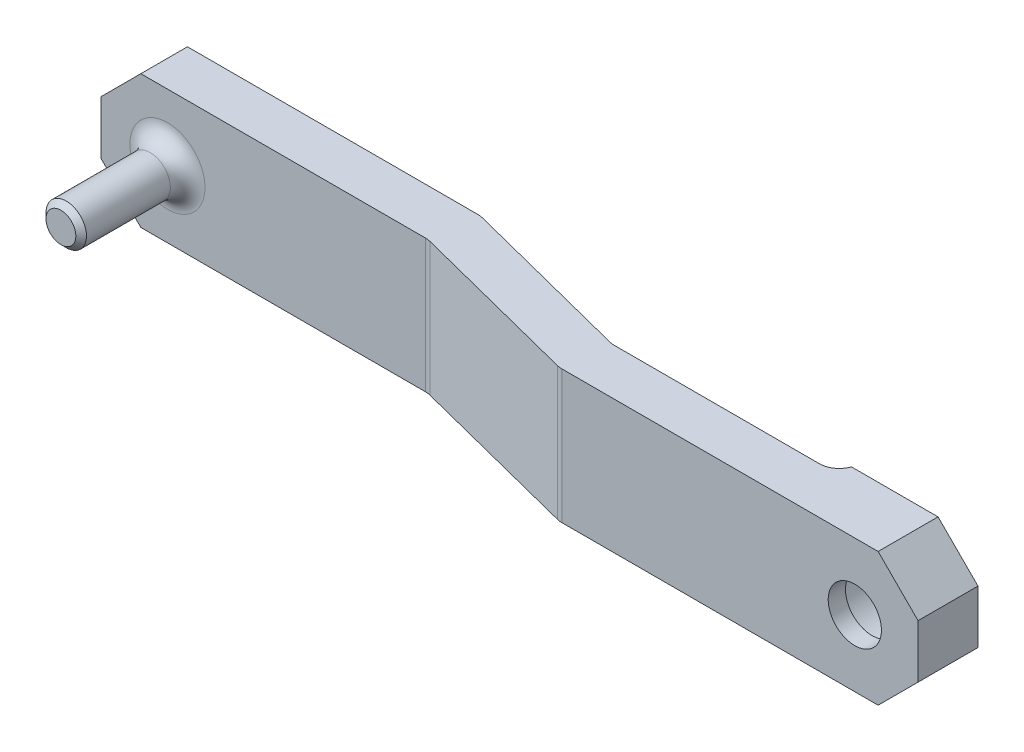
ISO-10303-21;
HEADER;
FILE_DESCRIPTION(('STEP AP214'),'2;1');
FILE_NAME('part.step','',(''),(''),'','','');
FILE_SCHEMA(('AUTOMOTIVE_DESIGN { 1 0 10303 214 1 1 1 1 }'));
ENDSEC;
DATA;
#1=APPLICATION_CONTEXT('core data for automotive mechanical design processes');
#2=APPLICATION_PROTOCOL_DEFINITION('international standard','automotive_design',2000,#1);
#3=PRODUCT_CONTEXT('',#1,'mechanical');
#4=PRODUCT('Part','Part','',(#3));
#5=PRODUCT_RELATED_PRODUCT_CATEGORY('part','',(#4));
#6=PRODUCT_DEFINITION_FORMATION('','',#4);
#7=PRODUCT_DEFINITION_CONTEXT('part definition',#1,'design');
#8=PRODUCT_DEFINITION('design','',#6,#7);
#9=PRODUCT_DEFINITION_SHAPE('','',#8);
#10=(LENGTH_UNIT() NAMED_UNIT(*) SI_UNIT(.MILLI.,.METRE.));
#11=(NAMED_UNIT(*) PLANE_ANGLE_UNIT() SI_UNIT($,.RADIAN.));
#12=(NAMED_UNIT(*) SI_UNIT($,.STERADIAN.) SOLID_ANGLE_UNIT());
#13=UNCERTAINTY_MEASURE_WITH_UNIT(LENGTH_MEASURE(1.E-05),#10,'distance_accuracy_value','');
#14=(GEOMETRIC_REPRESENTATION_CONTEXT(3) GLOBAL_UNCERTAINTY_ASSIGNED_CONTEXT((#13)) GLOBAL_UNIT_ASSIGNED_CONTEXT((#10,
#11,#12)) REPRESENTATION_CONTEXT('',''));
#15=CARTESIAN_POINT('',(0.,0.,0.));
#16=DIRECTION('',(0.,0.,1.));
#17=DIRECTION('',(1.,0.,0.));
#18=AXIS2_PLACEMENT_3D('',#15,#16,#17);
#19=CARTESIAN_POINT('',(31.75,12.7,0.));
#20=DIRECTION('',(0.,0.,1.));
#21=DIRECTION('',(1.,0.,0.));
#22=AXIS2_PLACEMENT_3D('',#19,#20,#21);
#23=PLANE('',#22);
#24=DIRECTION('',(-1.,0.,0.));
#25=VECTOR('',#24,1.);
#26=CARTESIAN_POINT('',(31.75,12.7,0.));
#27=LINE('',#26,#25);
#28=CARTESIAN_POINT('',(31.5103174828358,12.7,0.));
#29=VERTEX_POINT('',#28);
#30=CARTESIAN_POINT('',(3.80999999999999,12.7,0.));
#31=VERTEX_POINT('',#30);
#32=EDGE_CURVE('E552',#29,#31,#27,.T.);
#33=ORIENTED_EDGE('',*,*,#32,.F.);
#34=DIRECTION('',(0.,-1.,0.));
#35=VECTOR('',#34,1.);
#36=CARTESIAN_POINT('',(31.5103174828358,12.7,0.));
#37=LINE('',#36,#35);
#38=CARTESIAN_POINT('',(31.5103174828358,0.,0.));
#39=VERTEX_POINT('',#38);
#40=EDGE_CURVE('E689',#29,#39,#37,.T.);
#41=ORIENTED_EDGE('',*,*,#40,.T.);
#42=DIRECTION('',(-1.,0.,0.));
#43=VECTOR('',#42,1.);
#44=CARTESIAN_POINT('',(31.75,0.,0.));
#45=LINE('',#44,#43);
#46=CARTESIAN_POINT('',(3.81000000000001,0.,0.));
#47=VERTEX_POINT('',#46);
#48=EDGE_CURVE('E551',#39,#47,#45,.T.);
#49=ORIENTED_EDGE('',*,*,#48,.T.);
#50=DIRECTION('',(0.707106781186549,-0.707106781186546,0.));
#51=VECTOR('',#50,1.);
#52=CARTESIAN_POINT('',(0.,3.80999999999999,0.));
#53=LINE('',#52,#51);
#54=CARTESIAN_POINT('',(0.,3.80999999999999,0.));
#55=VERTEX_POINT('',#54);
#56=EDGE_CURVE('E662',#47,#55,#53,.F.);
#57=ORIENTED_EDGE('',*,*,#56,.T.);
#58=DIRECTION('',(0.,-1.,0.));
#59=VECTOR('',#58,1.);
#60=CARTESIAN_POINT('',(0.,12.7,0.));
#61=LINE('',#60,#59);
#62=CARTESIAN_POINT('',(0.,8.88999999999998,0.));
#63=VERTEX_POINT('',#62);
#64=EDGE_CURVE('E599',#63,#55,#61,.T.);
#65=ORIENTED_EDGE('',*,*,#64,.F.);
#66=DIRECTION('',(0.707106781186546,0.707106781186549,0.));
#67=VECTOR('',#66,1.);
#68=CARTESIAN_POINT('',(3.80999999999999,12.7,0.));
#69=LINE('',#68,#67);
#70=EDGE_CURVE('E658',#63,#31,#69,.T.);
#71=ORIENTED_EDGE('',*,*,#70,.T.);
#72=EDGE_LOOP('',(#33,#41,#49,#57,#65,#71));
#73=FACE_BOUND('',#72,.T.);
#74=ADVANCED_FACE('F51',(#73),#23,.F.);
#75=CARTESIAN_POINT('',(0.,12.7,0.));
#76=DIRECTION('',(1.,0.,0.));
#77=DIRECTION('',(0.,0.,-1.));
#78=AXIS2_PLACEMENT_3D('',#75,#76,#77);
#79=PLANE('',#78);
#80=ORIENTED_EDGE('',*,*,#64,.T.);
#81=DIRECTION('',(0.,0.,1.));
#82=VECTOR('',#81,1.);
#83=CARTESIAN_POINT('',(0.,3.80999999999999,0.));
#84=LINE('',#83,#82);
#85=CARTESIAN_POINT('',(0.,3.80999999999999,4.445));
#86=VERTEX_POINT('',#85);
#87=EDGE_CURVE('E648',#55,#86,#84,.T.);
#88=ORIENTED_EDGE('',*,*,#87,.T.);
#89=DIRECTION('',(0.,-1.,0.));
#90=VECTOR('',#89,1.);
#91=CARTESIAN_POINT('',(0.,12.7,4.445));
#92=LINE('',#91,#90);
#93=CARTESIAN_POINT('',(0.,8.88999999999998,4.445));
#94=VERTEX_POINT('',#93);
#95=EDGE_CURVE('E595',#94,#86,#92,.T.);
#96=ORIENTED_EDGE('',*,*,#95,.F.);
#97=DIRECTION('',(0.,0.,-1.));
#98=VECTOR('',#97,1.);
#99=CARTESIAN_POINT('',(0.,8.88999999999998,0.));
#100=LINE('',#99,#98);
#101=EDGE_CURVE('E645',#94,#63,#100,.T.);
#102=ORIENTED_EDGE('',*,*,#101,.T.);
#103=EDGE_LOOP('',(#80,#88,#96,#102));
#104=FACE_BOUND('',#103,.T.);
#105=ADVANCED_FACE('F252',(#104),#79,.F.);
#106=CARTESIAN_POINT('',(0.,12.7,4.445));
#107=DIRECTION('',(0.,0.,-1.));
#108=DIRECTION('',(-1.,0.,0.));
#109=AXIS2_PLACEMENT_3D('',#106,#107,#108);
#110=PLANE('',#109);
#111=CARTESIAN_POINT('',(6.35,6.35,4.445));
#112=DIRECTION('',(0.,0.,-1.));
#113=DIRECTION('',(-1.,0.,0.));
#114=AXIS2_PLACEMENT_3D('',#111,#112,#113);
#115=CIRCLE('',#114,3.5814);
#116=CARTESIAN_POINT('',(2.7686,6.35,4.445));
#117=VERTEX_POINT('',#116);
#118=EDGE_CURVE('E603',#117,#117,#115,.T.);
#119=ORIENTED_EDGE('',*,*,#118,.T.);
#120=EDGE_LOOP('',(#119));
#121=FACE_BOUND('',#120,.T.);
#122=DIRECTION('',(1.,0.,0.));
#123=VECTOR('',#122,1.);
#124=CARTESIAN_POINT('',(0.,0.,4.445));
#125=LINE('',#124,#123);
#126=CARTESIAN_POINT('',(3.81000000000002,0.,4.445));
#127=VERTEX_POINT('',#126);
#128=CARTESIAN_POINT('',(30.9510582761194,0.,4.445));
#129=VERTEX_POINT('',#128);
#130=EDGE_CURVE('E570',#127,#129,#125,.T.);
#131=ORIENTED_EDGE('',*,*,#130,.T.);
#132=DIRECTION('',(0.,-1.,0.));
#133=VECTOR('',#132,1.);
#134=CARTESIAN_POINT('',(30.9510582761194,12.7,4.445));
#135=LINE('',#134,#133);
#136=CARTESIAN_POINT('',(30.9510582761194,12.7,4.445));
#137=VERTEX_POINT('',#136);
#138=EDGE_CURVE('E68',#129,#137,#135,.F.);
#139=ORIENTED_EDGE('',*,*,#138,.T.);
#140=DIRECTION('',(1.,0.,0.));
#141=VECTOR('',#140,1.);
#142=CARTESIAN_POINT('',(0.,12.7,4.445));
#143=LINE('',#142,#141);
#144=CARTESIAN_POINT('',(3.80999999999999,12.7,4.445));
#145=VERTEX_POINT('',#144);
#146=EDGE_CURVE('E555',#145,#137,#143,.T.);
#147=ORIENTED_EDGE('',*,*,#146,.F.);
#148=DIRECTION('',(-0.707106781186546,-0.707106781186549,0.));
#149=VECTOR('',#148,1.);
#150=CARTESIAN_POINT('',(3.80999999999999,12.7,4.445));
#151=LINE('',#150,#149);
#152=EDGE_CURVE('E652',#145,#94,#151,.T.);
#153=ORIENTED_EDGE('',*,*,#152,.T.);
#154=ORIENTED_EDGE('',*,*,#95,.T.);
#155=DIRECTION('',(-0.707106781186549,0.707106781186546,0.));
#156=VECTOR('',#155,1.);
#157=CARTESIAN_POINT('',(0.,3.80999999999999,4.445));
#158=LINE('',#157,#156);
#159=EDGE_CURVE('E655',#86,#127,#158,.F.);
#160=ORIENTED_EDGE('',*,*,#159,.T.);
#161=EDGE_LOOP('',(#131,#139,#147,#153,#154,#160));
#162=FACE_BOUND('',#161,.T.);
#163=ADVANCED_FACE('F260',(#121,#162),#110,.F.);
#164=CARTESIAN_POINT('',(31.1907407932836,12.7,4.445));
#165=DIRECTION('',(0.247713861588513,0.,-0.968833237857221));
#166=DIRECTION('',(-0.968833237857221,0.,-0.247713861588513));
#167=AXIS2_PLACEMENT_3D('',#164,#165,#166);
#168=PLANE('',#167);
#169=DIRECTION('',(0.968833237857221,0.,0.247713861588513));
#170=VECTOR('',#169,1.);
#171=CARTESIAN_POINT('',(31.1907407932836,0.,4.445));
#172=LINE('',#171,#170);
#173=CARTESIAN_POINT('',(31.4229531824455,0.,4.504372681882));
#174=VERTEX_POINT('',#173);
#175=CARTESIAN_POINT('',(47.7860284041216,0.,8.68812731811801));
#176=VERTEX_POINT('',#175);
#177=EDGE_CURVE('E573',#174,#176,#172,.T.);
#178=ORIENTED_EDGE('',*,*,#177,.T.);
#179=DIRECTION('',(0.,-1.,0.));
#180=VECTOR('',#179,1.);
#181=CARTESIAN_POINT('',(47.7860284041216,12.7,8.68812731811801));
#182=LINE('',#181,#180);
#183=CARTESIAN_POINT('',(47.7860284041216,12.7,8.68812731811801));
#184=VERTEX_POINT('',#183);
#185=EDGE_CURVE('E679',#176,#184,#182,.F.);
#186=ORIENTED_EDGE('',*,*,#185,.T.);
#187=DIRECTION('',(0.968833237857221,0.,0.247713861588513));
#188=VECTOR('',#187,1.);
#189=CARTESIAN_POINT('',(31.1907407932836,12.7,4.445));
#190=LINE('',#189,#188);
#191=CARTESIAN_POINT('',(31.4229531824455,12.7,4.504372681882));
#192=VERTEX_POINT('',#191);
#193=EDGE_CURVE('E559',#192,#184,#190,.T.);
#194=ORIENTED_EDGE('',*,*,#193,.F.);
#195=DIRECTION('',(0.,-1.,0.));
#196=VECTOR('',#195,1.);
#197=CARTESIAN_POINT('',(31.4229531824455,0.,4.504372681882));
#198=LINE('',#197,#196);
#199=EDGE_CURVE('E675',#192,#174,#198,.T.);
#200=ORIENTED_EDGE('',*,*,#199,.T.);
#201=EDGE_LOOP('',(#178,#186,#194,#200));
#202=FACE_BOUND('',#201,.T.);
#203=ADVANCED_FACE('F473',(#202),#168,.F.);
#204=CARTESIAN_POINT('',(48.0182407932836,12.7,8.7475));
#205=DIRECTION('',(0.,0.,-1.));
#206=DIRECTION('',(-1.,0.,0.));
#207=AXIS2_PLACEMENT_3D('',#204,#205,#206);
#208=PLANE('',#207);
#209=CARTESIAN_POINT('',(76.2,6.35,8.7475));
#210=DIRECTION('',(0.,0.,-1.));
#211=DIRECTION('',(-1.,0.,0.));
#212=AXIS2_PLACEMENT_3D('',#209,#210,#211);
#213=CIRCLE('',#212,2.54);
#214=CARTESIAN_POINT('',(73.66,6.35,8.7475));
#215=VERTEX_POINT('',#214);
#216=EDGE_CURVE('E538',#215,#215,#213,.T.);
#217=ORIENTED_EDGE('',*,*,#216,.T.);
#218=EDGE_LOOP('',(#217));
#219=FACE_BOUND('',#218,.T.);
#220=DIRECTION('',(1.,0.,0.));
#221=VECTOR('',#220,1.);
#222=CARTESIAN_POINT('',(48.0182407932836,12.7,8.7475));
#223=LINE('',#222,#221);
#224=CARTESIAN_POINT('',(48.2579233104478,12.7,8.7475));
#225=VERTEX_POINT('',#224);
#226=CARTESIAN_POINT('',(78.4225,12.7,8.7475));
#227=VERTEX_POINT('',#226);
#228=EDGE_CURVE('E202',#225,#227,#223,.T.);
#229=ORIENTED_EDGE('',*,*,#228,.F.);
#230=DIRECTION('',(0.,-1.,0.));
#231=VECTOR('',#230,1.);
#232=CARTESIAN_POINT('',(48.2579233104478,12.7,8.7475));
#233=LINE('',#232,#231);
#234=CARTESIAN_POINT('',(48.2579233104478,0.,8.7475));
#235=VERTEX_POINT('',#234);
#236=EDGE_CURVE('E665',#225,#235,#233,.T.);
#237=ORIENTED_EDGE('',*,*,#236,.T.);
#238=DIRECTION('',(1.,0.,0.));
#239=VECTOR('',#238,1.);
#240=CARTESIAN_POINT('',(48.0182407932836,0.,8.7475));
#241=LINE('',#240,#239);
#242=CARTESIAN_POINT('',(78.4225,0.,8.7475));
#243=VERTEX_POINT('',#242);
#244=EDGE_CURVE('E577',#235,#243,#241,.T.);
#245=ORIENTED_EDGE('',*,*,#244,.T.);
#246=DIRECTION('',(-0.707106781186549,-0.707106781186546,0.));
#247=VECTOR('',#246,1.);
#248=CARTESIAN_POINT('',(82.2325,3.80999999999999,8.7475));
#249=LINE('',#248,#247);
#250=CARTESIAN_POINT('',(82.2325,3.80999999999999,8.7475));
#251=VERTEX_POINT('',#250);
#252=EDGE_CURVE('E636',#243,#251,#249,.F.);
#253=ORIENTED_EDGE('',*,*,#252,.T.);
#254=DIRECTION('',(0.,-1.,0.));
#255=VECTOR('',#254,1.);
#256=CARTESIAN_POINT('',(82.2325,12.7,8.7475));
#257=LINE('',#256,#255);
#258=CARTESIAN_POINT('',(82.2325,8.88999999999999,8.7475));
#259=VERTEX_POINT('',#258);
#260=EDGE_CURVE('E591',#259,#251,#257,.T.);
#261=ORIENTED_EDGE('',*,*,#260,.F.);
#262=DIRECTION('',(-0.707106781186546,0.707106781186549,0.));
#263=VECTOR('',#262,1.);
#264=CARTESIAN_POINT('',(78.4225,12.7,8.7475));
#265=LINE('',#264,#263);
#266=EDGE_CURVE('E632',#259,#227,#265,.T.);
#267=ORIENTED_EDGE('',*,*,#266,.T.);
#268=EDGE_LOOP('',(#229,#237,#245,#253,#261,#267));
#269=FACE_BOUND('',#268,.T.);
#270=ADVANCED_FACE('F468',(#219,#269),#208,.F.);
#271=CARTESIAN_POINT('',(82.2325,12.7,8.7475));
#272=DIRECTION('',(-1.,0.,0.));
#273=DIRECTION('',(0.,0.,1.));
#274=AXIS2_PLACEMENT_3D('',#271,#272,#273);
#275=PLANE('',#274);
#276=ORIENTED_EDGE('',*,*,#260,.T.);
#277=DIRECTION('',(0.,0.,-1.));
#278=VECTOR('',#277,1.);
#279=CARTESIAN_POINT('',(82.2325,3.80999999999999,8.7475));
#280=LINE('',#279,#278);
#281=CARTESIAN_POINT('',(82.2325,3.80999999999999,3.0325));
#282=VERTEX_POINT('',#281);
#283=EDGE_CURVE('E614',#251,#282,#280,.T.);
#284=ORIENTED_EDGE('',*,*,#283,.T.);
#285=DIRECTION('',(0.,-1.,0.));
#286=VECTOR('',#285,1.);
#287=CARTESIAN_POINT('',(82.2325,12.7,3.0325));
#288=LINE('',#287,#286);
#289=CARTESIAN_POINT('',(82.2325,8.88999999999999,3.0325));
#290=VERTEX_POINT('',#289);
#291=EDGE_CURVE('E213',#290,#282,#288,.T.);
#292=ORIENTED_EDGE('',*,*,#291,.F.);
#293=DIRECTION('',(0.,0.,1.));
#294=VECTOR('',#293,1.);
#295=CARTESIAN_POINT('',(82.2325,8.88999999999999,8.7475));
#296=LINE('',#295,#294);
#297=EDGE_CURVE('E611',#290,#259,#296,.T.);
#298=ORIENTED_EDGE('',*,*,#297,.T.);
#299=EDGE_LOOP('',(#276,#284,#292,#298));
#300=FACE_BOUND('',#299,.T.);
#301=ADVANCED_FACE('F332',(#300),#275,.F.);
#302=CARTESIAN_POINT('',(82.2325,12.7,3.0325));
#303=DIRECTION('',(0.,0.,1.));
#304=DIRECTION('',(1.,0.,0.));
#305=AXIS2_PLACEMENT_3D('',#302,#303,#304);
#306=PLANE('',#305);
#307=CARTESIAN_POINT('',(76.2,6.35,3.0325));
#308=DIRECTION('',(0.,0.,1.));
#309=DIRECTION('',(1.,0.,0.));
#310=AXIS2_PLACEMENT_3D('',#307,#308,#309);
#311=CIRCLE('',#310,4.74980000000003);
#312=CARTESIAN_POINT('',(80.9498,6.35,3.0325));
#313=VERTEX_POINT('',#312);
#314=EDGE_CURVE('E227',#313,#313,#311,.T.);
#315=ORIENTED_EDGE('',*,*,#314,.T.);
#316=EDGE_LOOP('',(#315));
#317=FACE_BOUND('',#316,.T.);
#318=ORIENTED_EDGE('',*,*,#291,.T.);
#319=DIRECTION('',(0.707106781186549,0.707106781186546,0.));
#320=VECTOR('',#319,1.);
#321=CARTESIAN_POINT('',(82.2325,3.80999999999999,3.0325));
#322=LINE('',#321,#320);
#323=CARTESIAN_POINT('',(78.4225,0.,3.0325));
#324=VERTEX_POINT('',#323);
#325=EDGE_CURVE('E621',#282,#324,#322,.F.);
#326=ORIENTED_EDGE('',*,*,#325,.T.);
#327=DIRECTION('',(-1.,0.,0.));
#328=VECTOR('',#327,1.);
#329=CARTESIAN_POINT('',(82.2325,0.,3.0325));
#330=LINE('',#329,#328);
#331=CARTESIAN_POINT('',(70.1675,0.,3.0325));
#332=VERTEX_POINT('',#331);
#333=EDGE_CURVE('E210',#324,#332,#330,.T.);
#334=ORIENTED_EDGE('',*,*,#333,.T.);
#335=DIRECTION('',(0.,-1.,0.));
#336=VECTOR('',#335,1.);
#337=CARTESIAN_POINT('',(70.1675,12.7,3.0325));
#338=LINE('',#337,#336);
#339=CARTESIAN_POINT('',(70.1675,12.7,3.0325));
#340=VERTEX_POINT('',#339);
#341=EDGE_CURVE('E206',#340,#332,#338,.T.);
#342=ORIENTED_EDGE('',*,*,#341,.F.);
#343=DIRECTION('',(-1.,0.,0.));
#344=VECTOR('',#343,1.);
#345=CARTESIAN_POINT('',(82.2325,12.7,3.0325));
#346=LINE('',#345,#344);
#347=CARTESIAN_POINT('',(78.4225,12.7,3.0325));
#348=VERTEX_POINT('',#347);
#349=EDGE_CURVE('E189',#348,#340,#346,.T.);
#350=ORIENTED_EDGE('',*,*,#349,.F.);
#351=DIRECTION('',(0.707106781186546,-0.707106781186549,0.));
#352=VECTOR('',#351,1.);
#353=CARTESIAN_POINT('',(78.4225,12.7,3.0325));
#354=LINE('',#353,#352);
#355=EDGE_CURVE('E618',#348,#290,#354,.T.);
#356=ORIENTED_EDGE('',*,*,#355,.T.);
#357=EDGE_LOOP('',(#318,#326,#334,#342,#350,#356));
#358=FACE_BOUND('',#357,.T.);
#359=ADVANCED_FACE('F208',(#317,#358),#306,.F.);
#360=CARTESIAN_POINT('',(70.1675,12.7,4.3025));
#361=DIRECTION('',(0.,0.,1.));
#362=DIRECTION('',(1.,0.,0.));
#363=AXIS2_PLACEMENT_3D('',#360,#361,#362);
#364=PLANE('',#363);
#365=DIRECTION('',(-1.,0.,0.));
#366=VECTOR('',#365,1.);
#367=CARTESIAN_POINT('',(70.1675,0.,4.3025));
#368=LINE('',#367,#366);
#369=CARTESIAN_POINT('',(68.3714487757862,0.,4.3025));
#370=VERTEX_POINT('',#369);
#371=CARTESIAN_POINT('',(48.8171825171642,0.,4.30250000000001));
#372=VERTEX_POINT('',#371);
#373=EDGE_CURVE('E582',#370,#372,#368,.T.);
#374=ORIENTED_EDGE('',*,*,#373,.T.);
#375=DIRECTION('',(0.,-1.,0.));
#376=VECTOR('',#375,1.);
#377=CARTESIAN_POINT('',(48.8171825171642,12.7,4.30250000000001));
#378=LINE('',#377,#376);
#379=CARTESIAN_POINT('',(48.8171825171642,12.7,4.30250000000001));
#380=VERTEX_POINT('',#379);
#381=EDGE_CURVE('E702',#372,#380,#378,.F.);
#382=ORIENTED_EDGE('',*,*,#381,.T.);
#383=DIRECTION('',(-1.,0.,0.));
#384=VECTOR('',#383,1.);
#385=CARTESIAN_POINT('',(70.1675,12.7,4.3025));
#386=LINE('',#385,#384);
#387=CARTESIAN_POINT('',(68.3714487757862,12.7,4.3025));
#388=VERTEX_POINT('',#387);
#389=EDGE_CURVE('E201',#388,#380,#386,.T.);
#390=ORIENTED_EDGE('',*,*,#389,.F.);
#391=DIRECTION('',(0.,-1.,0.));
#392=VECTOR('',#391,1.);
#393=CARTESIAN_POINT('',(68.3714487757862,12.7,4.3025));
#394=LINE('',#393,#392);
#395=EDGE_CURVE('E219',#388,#370,#394,.T.);
#396=ORIENTED_EDGE('',*,*,#395,.T.);
#397=EDGE_LOOP('',(#374,#382,#390,#396));
#398=FACE_BOUND('',#397,.T.);
#399=ADVANCED_FACE('F331',(#398),#364,.F.);
#400=CARTESIAN_POINT('',(48.5775,12.7,4.30250000000001));
#401=DIRECTION('',(-0.247713861588513,0.,0.968833237857221));
#402=DIRECTION('',(0.968833237857221,0.,0.247713861588513));
#403=AXIS2_PLACEMENT_3D('',#400,#401,#402);
#404=PLANE('',#403);
#405=DIRECTION('',(-0.968833237857221,0.,-0.247713861588513));
#406=VECTOR('',#405,1.);
#407=CARTESIAN_POINT('',(48.5775,0.,4.30250000000001));
#408=LINE('',#407,#406);
#409=CARTESIAN_POINT('',(48.3452876108381,0.,4.24312731811801));
#410=VERTEX_POINT('',#409);
#411=CARTESIAN_POINT('',(31.9822123891619,0.,0.059372681881993));
#412=VERTEX_POINT('',#411);
#413=EDGE_CURVE('E556',#410,#412,#408,.T.);
#414=ORIENTED_EDGE('',*,*,#413,.T.);
#415=DIRECTION('',(0.,-1.,0.));
#416=VECTOR('',#415,1.);
#417=CARTESIAN_POINT('',(31.9822123891619,12.7,0.0593726818819938));
#418=LINE('',#417,#416);
#419=CARTESIAN_POINT('',(31.9822123891619,12.7,0.059372681881993));
#420=VERTEX_POINT('',#419);
#421=EDGE_CURVE('E697',#412,#420,#418,.F.);
#422=ORIENTED_EDGE('',*,*,#421,.T.);
#423=DIRECTION('',(-0.968833237857221,0.,-0.247713861588513));
#424=VECTOR('',#423,1.);
#425=CARTESIAN_POINT('',(48.5775,12.7,4.30250000000001));
#426=LINE('',#425,#424);
#427=CARTESIAN_POINT('',(48.3452876108381,12.7,4.24312731811801));
#428=VERTEX_POINT('',#427);
#429=EDGE_CURVE('E214',#428,#420,#426,.T.);
#430=ORIENTED_EDGE('',*,*,#429,.F.);
#431=DIRECTION('',(0.,-1.,0.));
#432=VECTOR('',#431,1.);
#433=CARTESIAN_POINT('',(48.3452876108381,0.,4.24312731811801));
#434=LINE('',#433,#432);
#435=EDGE_CURVE('E693',#428,#410,#434,.T.);
#436=ORIENTED_EDGE('',*,*,#435,.T.);
#437=EDGE_LOOP('',(#414,#422,#430,#436));
#438=FACE_BOUND('',#437,.T.);
#439=ADVANCED_FACE('F448',(#438),#404,.F.);
#440=CARTESIAN_POINT('',(0.,12.7,0.));
#441=DIRECTION('',(0.,1.,0.));
#442=DIRECTION('',(0.,0.,1.));
#443=AXIS2_PLACEMENT_3D('',#440,#441,#442);
#444=PLANE('',#443);
#445=ORIENTED_EDGE('',*,*,#193,.T.);
#446=CARTESIAN_POINT('',(48.2579233104478,12.7,6.8425));
#447=DIRECTION('',(0.,1.,0.));
#448=DIRECTION('',(0.,0.,1.));
#449=AXIS2_PLACEMENT_3D('',#446,#447,#448);
#450=CIRCLE('',#449,1.905);
#451=EDGE_CURVE('E684',#184,#225,#450,.T.);
#452=ORIENTED_EDGE('',*,*,#451,.T.);
#453=ORIENTED_EDGE('',*,*,#228,.T.);
#454=DIRECTION('',(0.,0.,-1.));
#455=VECTOR('',#454,1.);
#456=CARTESIAN_POINT('',(78.4225,12.7,3.0325));
#457=LINE('',#456,#455);
#458=EDGE_CURVE('E198',#227,#348,#457,.T.);
#459=ORIENTED_EDGE('',*,*,#458,.T.);
#460=ORIENTED_EDGE('',*,*,#349,.T.);
#461=CARTESIAN_POINT('',(68.3714487757862,12.7,2.3975));
#462=DIRECTION('',(0.,1.,0.));
#463=DIRECTION('',(0.,0.,1.));
#464=AXIS2_PLACEMENT_3D('',#461,#462,#463);
#465=CIRCLE('',#464,1.905);
#466=EDGE_CURVE('E195',#340,#388,#465,.F.);
#467=ORIENTED_EDGE('',*,*,#466,.T.);
#468=ORIENTED_EDGE('',*,*,#389,.T.);
#469=CARTESIAN_POINT('',(48.8171825171642,12.7,2.39750000000001));
#470=DIRECTION('',(0.,1.,0.));
#471=DIRECTION('',(0.,0.,1.));
#472=AXIS2_PLACEMENT_3D('',#469,#470,#471);
#473=CIRCLE('',#472,1.905);
#474=EDGE_CURVE('E229',#380,#428,#473,.F.);
#475=ORIENTED_EDGE('',*,*,#474,.T.);
#476=ORIENTED_EDGE('',*,*,#429,.T.);
#477=CARTESIAN_POINT('',(31.5103174828358,12.7,1.905));
#478=DIRECTION('',(0.,1.,0.));
#479=DIRECTION('',(0.,0.,1.));
#480=AXIS2_PLACEMENT_3D('',#477,#478,#479);
#481=CIRCLE('',#480,1.905);
#482=EDGE_CURVE('E76',#420,#29,#481,.T.);
#483=ORIENTED_EDGE('',*,*,#482,.T.);
#484=ORIENTED_EDGE('',*,*,#32,.T.);
#485=DIRECTION('',(0.,0.,1.));
#486=VECTOR('',#485,1.);
#487=CARTESIAN_POINT('',(3.80999999999999,12.7,4.445));
#488=LINE('',#487,#486);
#489=EDGE_CURVE('E639',#31,#145,#488,.T.);
#490=ORIENTED_EDGE('',*,*,#489,.T.);
#491=ORIENTED_EDGE('',*,*,#146,.T.);
#492=CARTESIAN_POINT('',(30.9510582761194,12.7,6.35));
#493=DIRECTION('',(0.,1.,0.));
#494=DIRECTION('',(0.,0.,1.));
#495=AXIS2_PLACEMENT_3D('',#492,#493,#494);
#496=CIRCLE('',#495,1.905);
#497=EDGE_CURVE('E708',#137,#192,#496,.F.);
#498=ORIENTED_EDGE('',*,*,#497,.T.);
#499=EDGE_LOOP('',(#445,#452,#453,#459,#460,#467,#468,#475,#476,#483,#484,#490,#491,#498));
#500=FACE_BOUND('',#499,.T.);
#501=ADVANCED_FACE('F192',(#500),#444,.T.);
#502=CARTESIAN_POINT('',(0.,0.,0.));
#503=DIRECTION('',(0.,1.,0.));
#504=DIRECTION('',(0.,0.,1.));
#505=AXIS2_PLACEMENT_3D('',#502,#503,#504);
#506=PLANE('',#505);
#507=ORIENTED_EDGE('',*,*,#244,.F.);
#508=CARTESIAN_POINT('',(48.2579233104478,0.,6.8425));
#509=DIRECTION('',(0.,1.,0.));
#510=DIRECTION('',(0.,0.,1.));
#511=AXIS2_PLACEMENT_3D('',#508,#509,#510);
#512=CIRCLE('',#511,1.905);
#513=EDGE_CURVE('E672',#235,#176,#512,.F.);
#514=ORIENTED_EDGE('',*,*,#513,.T.);
#515=ORIENTED_EDGE('',*,*,#177,.F.);
#516=CARTESIAN_POINT('',(30.9510582761194,0.,6.35));
#517=DIRECTION('',(0.,1.,0.));
#518=DIRECTION('',(0.,0.,1.));
#519=AXIS2_PLACEMENT_3D('',#516,#517,#518);
#520=CIRCLE('',#519,1.905);
#521=EDGE_CURVE('E705',#174,#129,#520,.T.);
#522=ORIENTED_EDGE('',*,*,#521,.T.);
#523=ORIENTED_EDGE('',*,*,#130,.F.);
#524=DIRECTION('',(0.,0.,-1.));
#525=VECTOR('',#524,1.);
#526=CARTESIAN_POINT('',(3.81000000000002,0.,0.));
#527=LINE('',#526,#525);
#528=EDGE_CURVE('E624',#127,#47,#527,.T.);
#529=ORIENTED_EDGE('',*,*,#528,.T.);
#530=ORIENTED_EDGE('',*,*,#48,.F.);
#531=CARTESIAN_POINT('',(31.5103174828358,0.,1.905));
#532=DIRECTION('',(0.,1.,0.));
#533=DIRECTION('',(0.,0.,1.));
#534=AXIS2_PLACEMENT_3D('',#531,#532,#533);
#535=CIRCLE('',#534,1.905);
#536=EDGE_CURVE('E669',#39,#412,#535,.F.);
#537=ORIENTED_EDGE('',*,*,#536,.T.);
#538=ORIENTED_EDGE('',*,*,#413,.F.);
#539=CARTESIAN_POINT('',(48.8171825171642,0.,2.39750000000001));
#540=DIRECTION('',(0.,1.,0.));
#541=DIRECTION('',(0.,0.,1.));
#542=AXIS2_PLACEMENT_3D('',#539,#540,#541);
#543=CIRCLE('',#542,1.905);
#544=EDGE_CURVE('E711',#410,#372,#543,.T.);
#545=ORIENTED_EDGE('',*,*,#544,.T.);
#546=ORIENTED_EDGE('',*,*,#373,.F.);
#547=CARTESIAN_POINT('',(68.3714487757862,0.,2.3975));
#548=DIRECTION('',(0.,1.,0.));
#549=DIRECTION('',(0.,0.,1.));
#550=AXIS2_PLACEMENT_3D('',#547,#548,#549);
#551=CIRCLE('',#550,1.905);
#552=EDGE_CURVE('E222',#370,#332,#551,.T.);
#553=ORIENTED_EDGE('',*,*,#552,.T.);
#554=ORIENTED_EDGE('',*,*,#333,.F.);
#555=DIRECTION('',(0.,0.,1.));
#556=VECTOR('',#555,1.);
#557=CARTESIAN_POINT('',(78.4225,0.,0.));
#558=LINE('',#557,#556);
#559=EDGE_CURVE('E628',#324,#243,#558,.T.);
#560=ORIENTED_EDGE('',*,*,#559,.T.);
#561=EDGE_LOOP('',(#507,#514,#515,#522,#523,#529,#530,#537,#538,#545,#546,#553,#554,#560));
#562=FACE_BOUND('',#561,.T.);
#563=ADVANCED_FACE('F346',(#562),#506,.F.);
#564=CARTESIAN_POINT('',(76.2,6.35,7.09650000000001));
#565=DIRECTION('',(0.,0.,-1.));
#566=DIRECTION('',(-1.,0.,0.));
#567=AXIS2_PLACEMENT_3D('',#564,#565,#566);
#568=CYLINDRICAL_SURFACE('',#567,4.11480000000001);
#569=CARTESIAN_POINT('',(76.2,6.35,3.66750000000001));
#570=DIRECTION('',(0.,0.,1.));
#571=DIRECTION('',(1.,0.,0.));
#572=AXIS2_PLACEMENT_3D('',#569,#570,#571);
#573=CIRCLE('',#572,4.11480000000001);
#574=CARTESIAN_POINT('',(80.3148,6.35,3.66750000000001));
#575=VERTEX_POINT('',#574);
#576=EDGE_CURVE('E221',#575,#575,#573,.F.);
#577=ORIENTED_EDGE('',*,*,#576,.T.);
#578=EDGE_LOOP('',(#577));
#579=FACE_BOUND('',#578,.T.);
#580=CARTESIAN_POINT('',(76.2,6.35,7.09650000000001));
#581=DIRECTION('',(0.,0.,-1.));
#582=DIRECTION('',(-1.,0.,0.));
#583=AXIS2_PLACEMENT_3D('',#580,#581,#582);
#584=CIRCLE('',#583,4.11480000000001);
#585=CARTESIAN_POINT('',(72.0852,6.35,7.09650000000001));
#586=VERTEX_POINT('',#585);
#587=EDGE_CURVE('E545',#586,#586,#584,.T.);
#588=ORIENTED_EDGE('',*,*,#587,.F.);
#589=EDGE_LOOP('',(#588));
#590=FACE_BOUND('',#589,.T.);
#591=ADVANCED_FACE('F340',(#579,#590),#568,.F.);
#592=CARTESIAN_POINT('',(76.2,6.35,7.09650000000001));
#593=DIRECTION('',(0.,0.,-1.));
#594=DIRECTION('',(-1.,0.,0.));
#595=AXIS2_PLACEMENT_3D('',#592,#593,#594);
#596=PLANE('',#595);
#597=CARTESIAN_POINT('',(76.2,6.35,7.09650000000001));
#598=DIRECTION('',(0.,0.,-1.));
#599=DIRECTION('',(-1.,0.,0.));
#600=AXIS2_PLACEMENT_3D('',#597,#598,#599);
#601=CIRCLE('',#600,2.54);
#602=CARTESIAN_POINT('',(73.66,6.35,7.09650000000001));
#603=VERTEX_POINT('',#602);
#604=EDGE_CURVE('E541',#603,#603,#601,.T.);
#605=ORIENTED_EDGE('',*,*,#604,.F.);
#606=EDGE_LOOP('',(#605));
#607=FACE_BOUND('',#606,.T.);
#608=ORIENTED_EDGE('',*,*,#587,.T.);
#609=EDGE_LOOP('',(#608));
#610=FACE_BOUND('',#609,.T.);
#611=ADVANCED_FACE('F345',(#607,#610),#596,.T.);
#612=CARTESIAN_POINT('',(76.2,6.35,8.7475));
#613=DIRECTION('',(0.,0.,-1.));
#614=DIRECTION('',(-1.,0.,0.));
#615=AXIS2_PLACEMENT_3D('',#612,#613,#614);
#616=CYLINDRICAL_SURFACE('',#615,2.54);
#617=ORIENTED_EDGE('',*,*,#216,.F.);
#618=EDGE_LOOP('',(#617));
#619=FACE_BOUND('',#618,.T.);
#620=ORIENTED_EDGE('',*,*,#604,.T.);
#621=EDGE_LOOP('',(#620));
#622=FACE_BOUND('',#621,.T.);
#623=ADVANCED_FACE('F362',(#619,#622),#616,.F.);
#624=CARTESIAN_POINT('',(6.35,6.35,14.605));
#625=DIRECTION('',(0.,0.,-1.));
#626=DIRECTION('',(-1.,0.,0.));
#627=AXIS2_PLACEMENT_3D('',#624,#625,#626);
#628=CYLINDRICAL_SURFACE('',#627,1.9304);
#629=CARTESIAN_POINT('',(6.35,6.35,14.097));
#630=DIRECTION('',(0.,0.,-1.));
#631=DIRECTION('',(-1.,0.,0.));
#632=AXIS2_PLACEMENT_3D('',#629,#630,#631);
#633=CIRCLE('',#632,1.9304);
#634=CARTESIAN_POINT('',(4.4196,6.35,14.097));
#635=VERTEX_POINT('',#634);
#636=EDGE_CURVE('E61',#635,#635,#633,.T.);
#637=ORIENTED_EDGE('',*,*,#636,.T.);
#638=EDGE_LOOP('',(#637));
#639=FACE_BOUND('',#638,.T.);
#640=CARTESIAN_POINT('',(6.35,6.35,6.096));
#641=DIRECTION('',(0.,0.,-1.));
#642=DIRECTION('',(-1.,0.,0.));
#643=AXIS2_PLACEMENT_3D('',#640,#641,#642);
#644=CIRCLE('',#643,1.9304);
#645=CARTESIAN_POINT('',(4.4196,6.35,6.096));
#646=VERTEX_POINT('',#645);
#647=EDGE_CURVE('E607',#646,#646,#644,.F.);
#648=ORIENTED_EDGE('',*,*,#647,.T.);
#649=EDGE_LOOP('',(#648));
#650=FACE_BOUND('',#649,.T.);
#651=ADVANCED_FACE('F239',(#639,#650),#628,.T.);
#652=CARTESIAN_POINT('',(6.35,6.35,14.605));
#653=DIRECTION('',(0.,0.,-1.));
#654=DIRECTION('',(-1.,0.,0.));
#655=AXIS2_PLACEMENT_3D('',#652,#653,#654);
#656=PLANE('',#655);
#657=CARTESIAN_POINT('',(6.35,6.35,14.605));
#658=DIRECTION('',(0.,0.,-1.));
#659=DIRECTION('',(-1.,0.,0.));
#660=AXIS2_PLACEMENT_3D('',#657,#658,#659);
#661=CIRCLE('',#660,1.4224);
#662=CARTESIAN_POINT('',(4.92759999999999,6.35,14.605));
#663=VERTEX_POINT('',#662);
#664=EDGE_CURVE('E11',#663,#663,#661,.F.);
#665=ORIENTED_EDGE('',*,*,#664,.T.);
#666=EDGE_LOOP('',(#665));
#667=FACE_BOUND('',#666,.T.);
#668=ADVANCED_FACE('F269',(#667),#656,.F.);
#669=CARTESIAN_POINT('',(6.35,6.35,6.096));
#670=DIRECTION('',(0.,0.,-1.));
#671=DIRECTION('',(-1.,0.,0.));
#672=AXIS2_PLACEMENT_3D('',#669,#670,#671);
#673=TOROIDAL_SURFACE('',#672,3.5814,1.651);
#674=ORIENTED_EDGE('',*,*,#647,.F.);
#675=EDGE_LOOP('',(#674));
#676=FACE_BOUND('',#675,.T.);
#677=ORIENTED_EDGE('',*,*,#118,.F.);
#678=EDGE_LOOP('',(#677));
#679=FACE_BOUND('',#678,.T.);
#680=ADVANCED_FACE('F265',(#676,#679),#673,.F.);
#681=CARTESIAN_POINT('',(82.2325,3.80999999999999,8.7475));
#682=DIRECTION('',(-0.707106781186546,0.707106781186549,0.));
#683=DIRECTION('',(0.,0.,-1.));
#684=AXIS2_PLACEMENT_3D('',#681,#682,#683);
#685=PLANE('',#684);
#686=ORIENTED_EDGE('',*,*,#252,.F.);
#687=ORIENTED_EDGE('',*,*,#559,.F.);
#688=ORIENTED_EDGE('',*,*,#325,.F.);
#689=ORIENTED_EDGE('',*,*,#283,.F.);
#690=EDGE_LOOP('',(#686,#687,#688,#689));
#691=FACE_BOUND('',#690,.T.);
#692=ADVANCED_FACE('F268',(#691),#685,.F.);
#693=CARTESIAN_POINT('',(78.4225,12.7,0.));
#694=DIRECTION('',(0.707106781186549,0.707106781186546,0.));
#695=DIRECTION('',(0.,0.,1.));
#696=AXIS2_PLACEMENT_3D('',#693,#694,#695);
#697=PLANE('',#696);
#698=ORIENTED_EDGE('',*,*,#266,.F.);
#699=ORIENTED_EDGE('',*,*,#297,.F.);
#700=ORIENTED_EDGE('',*,*,#355,.F.);
#701=ORIENTED_EDGE('',*,*,#458,.F.);
#702=EDGE_LOOP('',(#698,#699,#700,#701));
#703=FACE_BOUND('',#702,.T.);
#704=ADVANCED_FACE('F277',(#703),#697,.T.);
#705=CARTESIAN_POINT('',(0.,3.80999999999999,0.));
#706=DIRECTION('',(0.707106781186546,0.707106781186549,0.));
#707=DIRECTION('',(0.,0.,1.));
#708=AXIS2_PLACEMENT_3D('',#705,#706,#707);
#709=PLANE('',#708);
#710=ORIENTED_EDGE('',*,*,#56,.F.);
#711=ORIENTED_EDGE('',*,*,#528,.F.);
#712=ORIENTED_EDGE('',*,*,#159,.F.);
#713=ORIENTED_EDGE('',*,*,#87,.F.);
#714=EDGE_LOOP('',(#710,#711,#712,#713));
#715=FACE_BOUND('',#714,.T.);
#716=ADVANCED_FACE('F284',(#715),#709,.F.);
#717=CARTESIAN_POINT('',(3.80999999999999,12.7,0.));
#718=DIRECTION('',(-0.707106781186549,0.707106781186546,0.));
#719=DIRECTION('',(0.,0.,-1.));
#720=AXIS2_PLACEMENT_3D('',#717,#718,#719);
#721=PLANE('',#720);
#722=ORIENTED_EDGE('',*,*,#70,.F.);
#723=ORIENTED_EDGE('',*,*,#101,.F.);
#724=ORIENTED_EDGE('',*,*,#152,.F.);
#725=ORIENTED_EDGE('',*,*,#489,.F.);
#726=EDGE_LOOP('',(#722,#723,#724,#725));
#727=FACE_BOUND('',#726,.T.);
#728=ADVANCED_FACE('F291',(#727),#721,.T.);
#729=CARTESIAN_POINT('',(48.2579233104478,12.7,6.8425));
#730=DIRECTION('',(0.,-1.,0.));
#731=DIRECTION('',(0.,0.,-1.));
#732=AXIS2_PLACEMENT_3D('',#729,#730,#731);
#733=CYLINDRICAL_SURFACE('',#732,1.905);
#734=ORIENTED_EDGE('',*,*,#451,.F.);
#735=ORIENTED_EDGE('',*,*,#185,.F.);
#736=ORIENTED_EDGE('',*,*,#513,.F.);
#737=ORIENTED_EDGE('',*,*,#236,.F.);
#738=EDGE_LOOP('',(#734,#735,#736,#737));
#739=FACE_BOUND('',#738,.T.);
#740=ADVANCED_FACE('F297',(#739),#733,.T.);
#741=CARTESIAN_POINT('',(30.9510582761194,12.7,6.35));
#742=DIRECTION('',(0.,1.,0.));
#743=DIRECTION('',(0.,0.,1.));
#744=AXIS2_PLACEMENT_3D('',#741,#742,#743);
#745=CYLINDRICAL_SURFACE('',#744,1.905);
#746=ORIENTED_EDGE('',*,*,#497,.F.);
#747=ORIENTED_EDGE('',*,*,#138,.F.);
#748=ORIENTED_EDGE('',*,*,#521,.F.);
#749=ORIENTED_EDGE('',*,*,#199,.F.);
#750=EDGE_LOOP('',(#746,#747,#748,#749));
#751=FACE_BOUND('',#750,.T.);
#752=ADVANCED_FACE('F301',(#751),#745,.F.);
#753=CARTESIAN_POINT('',(31.5103174828358,12.7,1.905));
#754=DIRECTION('',(0.,-1.,0.));
#755=DIRECTION('',(0.,0.,-1.));
#756=AXIS2_PLACEMENT_3D('',#753,#754,#755);
#757=CYLINDRICAL_SURFACE('',#756,1.905);
#758=ORIENTED_EDGE('',*,*,#482,.F.);
#759=ORIENTED_EDGE('',*,*,#421,.F.);
#760=ORIENTED_EDGE('',*,*,#536,.F.);
#761=ORIENTED_EDGE('',*,*,#40,.F.);
#762=EDGE_LOOP('',(#758,#759,#760,#761));
#763=FACE_BOUND('',#762,.T.);
#764=ADVANCED_FACE('F305',(#763),#757,.T.);
#765=CARTESIAN_POINT('',(48.8171825171642,12.7,2.39750000000001));
#766=DIRECTION('',(0.,1.,0.));
#767=DIRECTION('',(0.,0.,1.));
#768=AXIS2_PLACEMENT_3D('',#765,#766,#767);
#769=CYLINDRICAL_SURFACE('',#768,1.905);
#770=ORIENTED_EDGE('',*,*,#474,.F.);
#771=ORIENTED_EDGE('',*,*,#381,.F.);
#772=ORIENTED_EDGE('',*,*,#544,.F.);
#773=ORIENTED_EDGE('',*,*,#435,.F.);
#774=EDGE_LOOP('',(#770,#771,#772,#773));
#775=FACE_BOUND('',#774,.T.);
#776=ADVANCED_FACE('F309',(#775),#769,.F.);
#777=CARTESIAN_POINT('',(68.3714487757862,12.7,2.3975));
#778=DIRECTION('',(0.,-1.,0.));
#779=DIRECTION('',(0.,0.,-1.));
#780=AXIS2_PLACEMENT_3D('',#777,#778,#779);
#781=CYLINDRICAL_SURFACE('',#780,1.905);
#782=ORIENTED_EDGE('',*,*,#466,.F.);
#783=ORIENTED_EDGE('',*,*,#341,.T.);
#784=ORIENTED_EDGE('',*,*,#552,.F.);
#785=ORIENTED_EDGE('',*,*,#395,.F.);
#786=EDGE_LOOP('',(#782,#783,#784,#785));
#787=FACE_BOUND('',#786,.T.);
#788=ADVANCED_FACE('F217',(#787),#781,.F.);
#789=CARTESIAN_POINT('',(76.2,6.35,3.66750000000001));
#790=DIRECTION('',(0.,0.,-1.));
#791=DIRECTION('',(-1.,0.,0.));
#792=AXIS2_PLACEMENT_3D('',#789,#790,#791);
#793=CONICAL_SURFACE('',#792,4.11480000000001,0.78539816339746);
#794=ORIENTED_EDGE('',*,*,#314,.F.);
#795=EDGE_LOOP('',(#794));
#796=FACE_BOUND('',#795,.T.);
#797=ORIENTED_EDGE('',*,*,#576,.F.);
#798=EDGE_LOOP('',(#797));
#799=FACE_BOUND('',#798,.T.);
#800=ADVANCED_FACE('F243',(#796,#799),#793,.F.);
#801=CARTESIAN_POINT('',(6.35,6.35,14.097));
#802=DIRECTION('',(0.,0.,-1.));
#803=DIRECTION('',(-1.,0.,0.));
#804=AXIS2_PLACEMENT_3D('',#801,#802,#803);
#805=CONICAL_SURFACE('',#804,1.9304,0.785398163397447);
#806=ORIENTED_EDGE('',*,*,#664,.F.);
#807=EDGE_LOOP('',(#806));
#808=FACE_BOUND('',#807,.T.);
#809=ORIENTED_EDGE('',*,*,#636,.F.);
#810=EDGE_LOOP('',(#809));
#811=FACE_BOUND('',#810,.T.);
#812=ADVANCED_FACE('F54',(#808,#811),#805,.T.);
#813=CLOSED_SHELL('',(#74,#105,#163,#203,#270,#301,#359,#399,#439,#501,#563,#591,#611,#623,#651,
#668,#680,#692,#704,#716,#728,#740,#752,#764,#776,#788,#800,#812));
#814=MANIFOLD_SOLID_BREP('B2',#813);
#815=ADVANCED_BREP_SHAPE_REPRESENTATION('',(#18,#814),#14);
#816=SHAPE_DEFINITION_REPRESENTATION(#9,#815);
ENDSEC;
END-ISO-10303-21;
